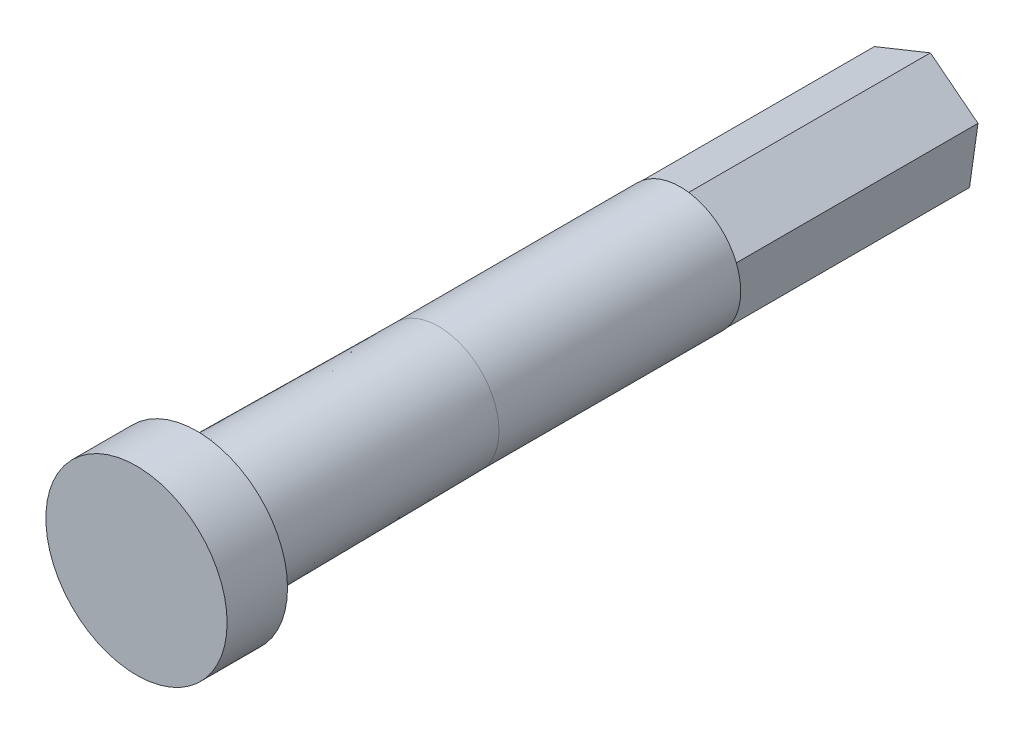
ISO-10303-21;
HEADER;
FILE_DESCRIPTION(('STEP AP214'),'2;1');
FILE_NAME('part.step','',(''),(''),'','','');
FILE_SCHEMA(('AUTOMOTIVE_DESIGN { 1 0 10303 214 1 1 1 1 }'));
ENDSEC;
DATA;
#1=APPLICATION_CONTEXT('core data for automotive mechanical design processes');
#2=APPLICATION_PROTOCOL_DEFINITION('international standard','automotive_design',2000,#1);
#3=PRODUCT_CONTEXT('',#1,'mechanical');
#4=PRODUCT('Part','Part','',(#3));
#5=PRODUCT_RELATED_PRODUCT_CATEGORY('part','',(#4));
#6=PRODUCT_DEFINITION_FORMATION('','',#4);
#7=PRODUCT_DEFINITION_CONTEXT('part definition',#1,'design');
#8=PRODUCT_DEFINITION('design','',#6,#7);
#9=PRODUCT_DEFINITION_SHAPE('','',#8);
#10=(LENGTH_UNIT() NAMED_UNIT(*) SI_UNIT(.MILLI.,.METRE.));
#11=(NAMED_UNIT(*) PLANE_ANGLE_UNIT() SI_UNIT($,.RADIAN.));
#12=(NAMED_UNIT(*) SI_UNIT($,.STERADIAN.) SOLID_ANGLE_UNIT());
#13=UNCERTAINTY_MEASURE_WITH_UNIT(LENGTH_MEASURE(1.E-05),#10,'distance_accuracy_value','');
#14=(GEOMETRIC_REPRESENTATION_CONTEXT(3) GLOBAL_UNCERTAINTY_ASSIGNED_CONTEXT((#13)) GLOBAL_UNIT_ASSIGNED_CONTEXT((#10,
#11,#12)) REPRESENTATION_CONTEXT('',''));
#15=CARTESIAN_POINT('',(0.,0.,0.));
#16=DIRECTION('',(0.,0.,1.));
#17=DIRECTION('',(1.,0.,0.));
#18=AXIS2_PLACEMENT_3D('',#15,#16,#17);
#19=CARTESIAN_POINT('',(0.,0.,-20.));
#20=DIRECTION('',(0.,0.,-1.));
#21=DIRECTION('',(-1.,0.,0.));
#22=AXIS2_PLACEMENT_3D('',#19,#20,#21);
#23=PLANE('',#22);
#24=DIRECTION('',(-0.14022037554384,-0.990120319093768,0.));
#25=VECTOR('',#24,1.);
#26=CARTESIAN_POINT('',(4.63789768455139,1.86812876098862,-20.));
#27=LINE('',#26,#25);
#28=CARTESIAN_POINT('',(4.63789768455139,1.86812876098862,-20.));
#29=VERTEX_POINT('',#28);
#30=CARTESIAN_POINT('',(3.93679580683219,-3.08247283448022,-20.));
#31=VERTEX_POINT('',#30);
#32=EDGE_CURVE('E127',#29,#31,#27,.T.);
#33=ORIENTED_EDGE('',*,*,#32,.F.);
#34=CARTESIAN_POINT('',(0.,0.,-20.));
#35=DIRECTION('',(0.,0.,-1.));
#36=DIRECTION('',(-1.,0.,0.));
#37=AXIS2_PLACEMENT_3D('',#34,#35,#36);
#38=CIRCLE('',#37,5.);
#39=EDGE_CURVE('E263',#29,#31,#38,.T.);
#40=ORIENTED_EDGE('',*,*,#39,.T.);
#41=EDGE_LOOP('',(#33,#40));
#42=FACE_BOUND('',#41,.T.);
#43=ADVANCED_FACE('F47',(#42),#23,.T.);
#44=DIRECTION('',(0.787359161366437,-0.616494566896044,0.));
#45=VECTOR('',#44,1.);
#46=CARTESIAN_POINT('',(0.701101877719202,4.95060159546884,-20.));
#47=LINE('',#46,#45);
#48=CARTESIAN_POINT('',(0.7011018777192,4.95060159546884,-20.));
#49=VERTEX_POINT('',#48);
#50=EDGE_CURVE('E124',#49,#29,#47,.T.);
#51=ORIENTED_EDGE('',*,*,#50,.F.);
#52=EDGE_CURVE('E147',#49,#29,#38,.T.);
#53=ORIENTED_EDGE('',*,*,#52,.T.);
#54=EDGE_LOOP('',(#51,#53));
#55=FACE_BOUND('',#54,.T.);
#56=ADVANCED_FACE('F175',(#55),#23,.T.);
#57=DIRECTION('',(0.927579536910278,0.373625752197724,0.));
#58=VECTOR('',#57,1.);
#59=CARTESIAN_POINT('',(-3.93679580683218,3.08247283448022,-20.));
#60=LINE('',#59,#58);
#61=CARTESIAN_POINT('',(-3.93679580683218,3.08247283448022,-20.));
#62=VERTEX_POINT('',#61);
#63=EDGE_CURVE('E231',#62,#49,#60,.T.);
#64=ORIENTED_EDGE('',*,*,#63,.F.);
#65=EDGE_CURVE('E143',#62,#49,#38,.T.);
#66=ORIENTED_EDGE('',*,*,#65,.T.);
#67=EDGE_LOOP('',(#64,#66));
#68=FACE_BOUND('',#67,.T.);
#69=ADVANCED_FACE('F181',(#68),#23,.T.);
#70=DIRECTION('',(0.14022037554384,0.990120319093768,0.));
#71=VECTOR('',#70,1.);
#72=CARTESIAN_POINT('',(-4.63789768455139,-1.86812876098862,-20.));
#73=LINE('',#72,#71);
#74=CARTESIAN_POINT('',(-4.63789768455139,-1.86812876098861,-20.));
#75=VERTEX_POINT('',#74);
#76=EDGE_CURVE('E62',#75,#62,#73,.T.);
#77=ORIENTED_EDGE('',*,*,#76,.F.);
#78=EDGE_CURVE('E136',#75,#62,#38,.T.);
#79=ORIENTED_EDGE('',*,*,#78,.T.);
#80=EDGE_LOOP('',(#77,#79));
#81=FACE_BOUND('',#80,.T.);
#82=ADVANCED_FACE('F190',(#81),#23,.T.);
#83=DIRECTION('',(-0.787359161366437,0.616494566896044,0.));
#84=VECTOR('',#83,1.);
#85=CARTESIAN_POINT('',(-0.701101877719199,-4.95060159546884,-20.));
#86=LINE('',#85,#84);
#87=CARTESIAN_POINT('',(-0.701101877719199,-4.95060159546884,-20.));
#88=VERTEX_POINT('',#87);
#89=EDGE_CURVE('E200',#88,#75,#86,.T.);
#90=ORIENTED_EDGE('',*,*,#89,.F.);
#91=EDGE_CURVE('E202',#88,#75,#38,.T.);
#92=ORIENTED_EDGE('',*,*,#91,.T.);
#93=EDGE_LOOP('',(#90,#92));
#94=FACE_BOUND('',#93,.T.);
#95=ADVANCED_FACE('F185',(#94),#23,.T.);
#96=CARTESIAN_POINT('',(0.,0.,0.));
#97=DIRECTION('',(0.,0.,1.));
#98=DIRECTION('',(1.,0.,0.));
#99=AXIS2_PLACEMENT_3D('',#96,#97,#98);
#100=CONICAL_SURFACE('',#99,5.,0.010471975511966);
#101=CARTESIAN_POINT('',(0.,0.,20.));
#102=DIRECTION('',(0.,0.,1.));
#103=DIRECTION('',(1.,0.,0.));
#104=AXIS2_PLACEMENT_3D('',#101,#102,#103);
#105=CIRCLE('',#104,5.20944716644594);
#106=CARTESIAN_POINT('',(5.20944716644594,0.,20.));
#107=VERTEX_POINT('',#106);
#108=EDGE_CURVE('E11',#107,#107,#105,.T.);
#109=ORIENTED_EDGE('',*,*,#108,.F.);
#110=EDGE_LOOP('',(#109));
#111=FACE_BOUND('',#110,.T.);
#112=CARTESIAN_POINT('',(0.,0.,0.));
#113=DIRECTION('',(0.,0.,-1.));
#114=DIRECTION('',(-1.,0.,0.));
#115=AXIS2_PLACEMENT_3D('',#112,#113,#114);
#116=CIRCLE('',#115,5.);
#117=CARTESIAN_POINT('',(-5.,0.,0.));
#118=VERTEX_POINT('',#117);
#119=EDGE_CURVE('E129',#118,#118,#116,.T.);
#120=ORIENTED_EDGE('',*,*,#119,.F.);
#121=EDGE_LOOP('',(#120));
#122=FACE_BOUND('',#121,.T.);
#123=ADVANCED_FACE('F49',(#111,#122),#100,.T.);
#124=CARTESIAN_POINT('',(0.,0.,25.));
#125=DIRECTION('',(0.,0.,-1.));
#126=DIRECTION('',(-1.,0.,0.));
#127=AXIS2_PLACEMENT_3D('',#124,#125,#126);
#128=CYLINDRICAL_SURFACE('',#127,7.5);
#129=CARTESIAN_POINT('',(0.,0.,25.));
#130=DIRECTION('',(0.,0.,1.));
#131=DIRECTION('',(1.,0.,0.));
#132=AXIS2_PLACEMENT_3D('',#129,#130,#131);
#133=CIRCLE('',#132,7.5);
#134=CARTESIAN_POINT('',(7.5,0.,25.));
#135=VERTEX_POINT('',#134);
#136=EDGE_CURVE('E56',#135,#135,#133,.T.);
#137=ORIENTED_EDGE('',*,*,#136,.F.);
#138=EDGE_LOOP('',(#137));
#139=FACE_BOUND('',#138,.T.);
#140=CARTESIAN_POINT('',(0.,0.,20.));
#141=DIRECTION('',(0.,0.,1.));
#142=DIRECTION('',(1.,0.,0.));
#143=AXIS2_PLACEMENT_3D('',#140,#141,#142);
#144=CIRCLE('',#143,7.5);
#145=CARTESIAN_POINT('',(7.5,0.,20.));
#146=VERTEX_POINT('',#145);
#147=EDGE_CURVE('E146',#146,#146,#144,.T.);
#148=ORIENTED_EDGE('',*,*,#147,.T.);
#149=EDGE_LOOP('',(#148));
#150=FACE_BOUND('',#149,.T.);
#151=ADVANCED_FACE('F157',(#139,#150),#128,.T.);
#152=CARTESIAN_POINT('',(0.,0.,25.));
#153=DIRECTION('',(0.,0.,1.));
#154=DIRECTION('',(1.,0.,0.));
#155=AXIS2_PLACEMENT_3D('',#152,#153,#154);
#156=PLANE('',#155);
#157=ORIENTED_EDGE('',*,*,#136,.T.);
#158=EDGE_LOOP('',(#157));
#159=FACE_BOUND('',#158,.T.);
#160=ADVANCED_FACE('F162',(#159),#156,.T.);
#161=CARTESIAN_POINT('',(0.,0.,20.));
#162=DIRECTION('',(0.,0.,1.));
#163=DIRECTION('',(1.,0.,0.));
#164=AXIS2_PLACEMENT_3D('',#161,#162,#163);
#165=PLANE('',#164);
#166=ORIENTED_EDGE('',*,*,#108,.T.);
#167=EDGE_LOOP('',(#166));
#168=FACE_BOUND('',#167,.T.);
#169=ORIENTED_EDGE('',*,*,#147,.F.);
#170=EDGE_LOOP('',(#169));
#171=FACE_BOUND('',#170,.T.);
#172=ADVANCED_FACE('F159',(#168,#171),#165,.F.);
#173=CARTESIAN_POINT('',(0.,0.,-20.));
#174=DIRECTION('',(0.,0.,1.));
#175=DIRECTION('',(1.,0.,0.));
#176=AXIS2_PLACEMENT_3D('',#173,#174,#175);
#177=CYLINDRICAL_SURFACE('',#176,5.);
#178=ORIENTED_EDGE('',*,*,#65,.F.);
#179=ORIENTED_EDGE('',*,*,#78,.F.);
#180=ORIENTED_EDGE('',*,*,#91,.F.);
#181=EDGE_CURVE('E267',#31,#88,#38,.T.);
#182=ORIENTED_EDGE('',*,*,#181,.F.);
#183=ORIENTED_EDGE('',*,*,#39,.F.);
#184=ORIENTED_EDGE('',*,*,#52,.F.);
#185=EDGE_LOOP('',(#178,#179,#180,#182,#183,#184));
#186=FACE_BOUND('',#185,.T.);
#187=ORIENTED_EDGE('',*,*,#119,.T.);
#188=EDGE_LOOP('',(#187));
#189=FACE_BOUND('',#188,.T.);
#190=ADVANCED_FACE('F161',(#186,#189),#177,.T.);
#191=DIRECTION('',(-0.927579536910277,-0.373625752197724,0.));
#192=VECTOR('',#191,1.);
#193=CARTESIAN_POINT('',(3.93679580683219,-3.08247283448022,-20.));
#194=LINE('',#193,#192);
#195=EDGE_CURVE('E69',#31,#88,#194,.T.);
#196=ORIENTED_EDGE('',*,*,#195,.F.);
#197=ORIENTED_EDGE('',*,*,#181,.T.);
#198=EDGE_LOOP('',(#196,#197));
#199=FACE_BOUND('',#198,.T.);
#200=ADVANCED_FACE('F169',(#199),#23,.T.);
#201=CARTESIAN_POINT('',(4.63789768455139,1.86812876098862,-40.));
#202=DIRECTION('',(-0.990120319093768,0.14022037554384,0.));
#203=DIRECTION('',(-0.14022037554384,-0.990120319093768,0.));
#204=AXIS2_PLACEMENT_3D('',#201,#202,#203);
#205=PLANE('',#204);
#206=ORIENTED_EDGE('',*,*,#32,.T.);
#207=DIRECTION('',(0.,0.,1.));
#208=VECTOR('',#207,1.);
#209=CARTESIAN_POINT('',(3.93679580683219,-3.08247283448022,-40.));
#210=LINE('',#209,#208);
#211=CARTESIAN_POINT('',(3.93679580683219,-3.08247283448022,-40.));
#212=VERTEX_POINT('',#211);
#213=EDGE_CURVE('E106',#212,#31,#210,.T.);
#214=ORIENTED_EDGE('',*,*,#213,.F.);
#215=DIRECTION('',(-0.14022037554384,-0.990120319093768,0.));
#216=VECTOR('',#215,1.);
#217=CARTESIAN_POINT('',(4.63789768455139,1.86812876098862,-40.));
#218=LINE('',#217,#216);
#219=CARTESIAN_POINT('',(4.63789768455139,1.86812876098862,-40.));
#220=VERTEX_POINT('',#219);
#221=EDGE_CURVE('E114',#220,#212,#218,.T.);
#222=ORIENTED_EDGE('',*,*,#221,.F.);
#223=DIRECTION('',(0.,0.,1.));
#224=VECTOR('',#223,1.);
#225=CARTESIAN_POINT('',(4.63789768455139,1.86812876098862,-40.));
#226=LINE('',#225,#224);
#227=EDGE_CURVE('E225',#220,#29,#226,.T.);
#228=ORIENTED_EDGE('',*,*,#227,.T.);
#229=EDGE_LOOP('',(#206,#214,#222,#228));
#230=FACE_BOUND('',#229,.T.);
#231=ADVANCED_FACE('F126',(#230),#205,.F.);
#232=CARTESIAN_POINT('',(3.93679580683219,-3.08247283448022,-40.));
#233=DIRECTION('',(-0.373625752197724,0.927579536910277,0.));
#234=DIRECTION('',(-0.927579536910278,-0.373625752197724,0.));
#235=AXIS2_PLACEMENT_3D('',#232,#233,#234);
#236=PLANE('',#235);
#237=ORIENTED_EDGE('',*,*,#195,.T.);
#238=DIRECTION('',(0.,0.,1.));
#239=VECTOR('',#238,1.);
#240=CARTESIAN_POINT('',(-0.701101877719199,-4.95060159546884,-40.));
#241=LINE('',#240,#239);
#242=CARTESIAN_POINT('',(-0.701101877719199,-4.95060159546884,-40.));
#243=VERTEX_POINT('',#242);
#244=EDGE_CURVE('E109',#243,#88,#241,.T.);
#245=ORIENTED_EDGE('',*,*,#244,.F.);
#246=DIRECTION('',(-0.927579536910277,-0.373625752197724,0.));
#247=VECTOR('',#246,1.);
#248=CARTESIAN_POINT('',(3.93679580683219,-3.08247283448022,-40.));
#249=LINE('',#248,#247);
#250=EDGE_CURVE('E102',#212,#243,#249,.T.);
#251=ORIENTED_EDGE('',*,*,#250,.F.);
#252=ORIENTED_EDGE('',*,*,#213,.T.);
#253=EDGE_LOOP('',(#237,#245,#251,#252));
#254=FACE_BOUND('',#253,.T.);
#255=ADVANCED_FACE('F104',(#254),#236,.F.);
#256=CARTESIAN_POINT('',(-0.701101877719199,-4.95060159546884,-40.));
#257=DIRECTION('',(0.616494566896044,0.787359161366437,0.));
#258=DIRECTION('',(-0.787359161366437,0.616494566896044,0.));
#259=AXIS2_PLACEMENT_3D('',#256,#257,#258);
#260=PLANE('',#259);
#261=ORIENTED_EDGE('',*,*,#89,.T.);
#262=DIRECTION('',(0.,0.,1.));
#263=VECTOR('',#262,1.);
#264=CARTESIAN_POINT('',(-4.63789768455139,-1.86812876098862,-40.));
#265=LINE('',#264,#263);
#266=CARTESIAN_POINT('',(-4.63789768455139,-1.86812876098862,-40.));
#267=VERTEX_POINT('',#266);
#268=EDGE_CURVE('E139',#267,#75,#265,.T.);
#269=ORIENTED_EDGE('',*,*,#268,.F.);
#270=DIRECTION('',(-0.787359161366437,0.616494566896044,0.));
#271=VECTOR('',#270,1.);
#272=CARTESIAN_POINT('',(-0.701101877719199,-4.95060159546884,-40.));
#273=LINE('',#272,#271);
#274=EDGE_CURVE('E113',#243,#267,#273,.T.);
#275=ORIENTED_EDGE('',*,*,#274,.F.);
#276=ORIENTED_EDGE('',*,*,#244,.T.);
#277=EDGE_LOOP('',(#261,#269,#275,#276));
#278=FACE_BOUND('',#277,.T.);
#279=ADVANCED_FACE('F210',(#278),#260,.F.);
#280=CARTESIAN_POINT('',(-4.63789768455139,-1.86812876098862,-40.));
#281=DIRECTION('',(0.990120319093768,-0.14022037554384,0.));
#282=DIRECTION('',(0.14022037554384,0.990120319093768,0.));
#283=AXIS2_PLACEMENT_3D('',#280,#281,#282);
#284=PLANE('',#283);
#285=ORIENTED_EDGE('',*,*,#76,.T.);
#286=DIRECTION('',(0.,0.,1.));
#287=VECTOR('',#286,1.);
#288=CARTESIAN_POINT('',(-3.93679580683218,3.08247283448022,-40.));
#289=LINE('',#288,#287);
#290=CARTESIAN_POINT('',(-3.93679580683218,3.08247283448022,-40.));
#291=VERTEX_POINT('',#290);
#292=EDGE_CURVE('E243',#291,#62,#289,.T.);
#293=ORIENTED_EDGE('',*,*,#292,.F.);
#294=DIRECTION('',(0.14022037554384,0.990120319093768,0.));
#295=VECTOR('',#294,1.);
#296=CARTESIAN_POINT('',(-4.63789768455139,-1.86812876098862,-40.));
#297=LINE('',#296,#295);
#298=EDGE_CURVE('E213',#267,#291,#297,.T.);
#299=ORIENTED_EDGE('',*,*,#298,.F.);
#300=ORIENTED_EDGE('',*,*,#268,.T.);
#301=EDGE_LOOP('',(#285,#293,#299,#300));
#302=FACE_BOUND('',#301,.T.);
#303=ADVANCED_FACE('F249',(#302),#284,.F.);
#304=CARTESIAN_POINT('',(-3.93679580683218,3.08247283448022,-40.));
#305=DIRECTION('',(0.373625752197724,-0.927579536910278,0.));
#306=DIRECTION('',(0.927579536910278,0.373625752197724,0.));
#307=AXIS2_PLACEMENT_3D('',#304,#305,#306);
#308=PLANE('',#307);
#309=ORIENTED_EDGE('',*,*,#63,.T.);
#310=DIRECTION('',(0.,0.,1.));
#311=VECTOR('',#310,1.);
#312=CARTESIAN_POINT('',(0.701101877719202,4.95060159546884,-40.));
#313=LINE('',#312,#311);
#314=CARTESIAN_POINT('',(0.701101877719202,4.95060159546884,-40.));
#315=VERTEX_POINT('',#314);
#316=EDGE_CURVE('E239',#315,#49,#313,.T.);
#317=ORIENTED_EDGE('',*,*,#316,.F.);
#318=DIRECTION('',(0.927579536910278,0.373625752197724,0.));
#319=VECTOR('',#318,1.);
#320=CARTESIAN_POINT('',(-3.93679580683218,3.08247283448022,-40.));
#321=LINE('',#320,#319);
#322=EDGE_CURVE('E219',#291,#315,#321,.T.);
#323=ORIENTED_EDGE('',*,*,#322,.F.);
#324=ORIENTED_EDGE('',*,*,#292,.T.);
#325=EDGE_LOOP('',(#309,#317,#323,#324));
#326=FACE_BOUND('',#325,.T.);
#327=ADVANCED_FACE('F254',(#326),#308,.F.);
#328=CARTESIAN_POINT('',(0.701101877719202,4.95060159546884,-40.));
#329=DIRECTION('',(-0.616494566896044,-0.787359161366437,0.));
#330=DIRECTION('',(0.787359161366437,-0.616494566896044,0.));
#331=AXIS2_PLACEMENT_3D('',#328,#329,#330);
#332=PLANE('',#331);
#333=ORIENTED_EDGE('',*,*,#50,.T.);
#334=ORIENTED_EDGE('',*,*,#227,.F.);
#335=DIRECTION('',(0.787359161366437,-0.616494566896044,0.));
#336=VECTOR('',#335,1.);
#337=CARTESIAN_POINT('',(0.701101877719202,4.95060159546884,-40.));
#338=LINE('',#337,#336);
#339=EDGE_CURVE('E119',#315,#220,#338,.T.);
#340=ORIENTED_EDGE('',*,*,#339,.F.);
#341=ORIENTED_EDGE('',*,*,#316,.T.);
#342=EDGE_LOOP('',(#333,#334,#340,#341));
#343=FACE_BOUND('',#342,.T.);
#344=ADVANCED_FACE('F256',(#343),#332,.F.);
#345=CARTESIAN_POINT('',(0.,0.,-40.));
#346=DIRECTION('',(0.,0.,-1.));
#347=DIRECTION('',(-1.,0.,0.));
#348=AXIS2_PLACEMENT_3D('',#345,#346,#347);
#349=PLANE('',#348);
#350=CARTESIAN_POINT('',(0.,0.,-40.));
#351=DIRECTION('',(0.,0.,-1.));
#352=DIRECTION('',(-1.,0.,0.));
#353=AXIS2_PLACEMENT_3D('',#350,#351,#352);
#354=CIRCLE('',#353,2.);
#355=CARTESIAN_POINT('',(-2.,0.,-40.));
#356=VERTEX_POINT('',#355);
#357=EDGE_CURVE('E290',#356,#356,#354,.T.);
#358=ORIENTED_EDGE('',*,*,#357,.F.);
#359=EDGE_LOOP('',(#358));
#360=FACE_BOUND('',#359,.T.);
#361=ORIENTED_EDGE('',*,*,#221,.T.);
#362=ORIENTED_EDGE('',*,*,#250,.T.);
#363=ORIENTED_EDGE('',*,*,#274,.T.);
#364=ORIENTED_EDGE('',*,*,#298,.T.);
#365=ORIENTED_EDGE('',*,*,#322,.T.);
#366=ORIENTED_EDGE('',*,*,#339,.T.);
#367=EDGE_LOOP('',(#361,#362,#363,#364,#365,#366));
#368=FACE_BOUND('',#367,.T.);
#369=ADVANCED_FACE('F117',(#360,#368),#349,.T.);
#370=CARTESIAN_POINT('',(0.,0.,-34.));
#371=DIRECTION('',(0.,0.,-1.));
#372=DIRECTION('',(-1.,0.,0.));
#373=AXIS2_PLACEMENT_3D('',#370,#371,#372);
#374=CYLINDRICAL_SURFACE('',#373,2.);
#375=CARTESIAN_POINT('',(0.,0.,-34.));
#376=DIRECTION('',(0.,0.,-1.));
#377=DIRECTION('',(-1.,0.,0.));
#378=AXIS2_PLACEMENT_3D('',#375,#376,#377);
#379=CIRCLE('',#378,2.);
#380=CARTESIAN_POINT('',(-2.,0.,-34.));
#381=VERTEX_POINT('',#380);
#382=EDGE_CURVE('E227',#381,#381,#379,.T.);
#383=ORIENTED_EDGE('',*,*,#382,.F.);
#384=EDGE_LOOP('',(#383));
#385=FACE_BOUND('',#384,.T.);
#386=ORIENTED_EDGE('',*,*,#357,.T.);
#387=EDGE_LOOP('',(#386));
#388=FACE_BOUND('',#387,.T.);
#389=ADVANCED_FACE('F303',(#385,#388),#374,.F.);
#390=CARTESIAN_POINT('',(0.,0.,-34.));
#391=DIRECTION('',(0.,0.,-1.));
#392=DIRECTION('',(-1.,0.,0.));
#393=AXIS2_PLACEMENT_3D('',#390,#391,#392);
#394=PLANE('',#393);
#395=ORIENTED_EDGE('',*,*,#382,.T.);
#396=EDGE_LOOP('',(#395));
#397=FACE_BOUND('',#396,.T.);
#398=ADVANCED_FACE('F311',(#397),#394,.T.);
#399=CLOSED_SHELL('',(#43,#56,#69,#82,#95,#123,#151,#160,#172,#190,#200,#231,#255,#279,#303,
#327,#344,#369,#389,#398));
#400=MANIFOLD_SOLID_BREP('B2',#399);
#401=ADVANCED_BREP_SHAPE_REPRESENTATION('',(#18,#400),#14);
#402=SHAPE_DEFINITION_REPRESENTATION(#9,#401);
ENDSEC;
END-ISO-10303-21;
